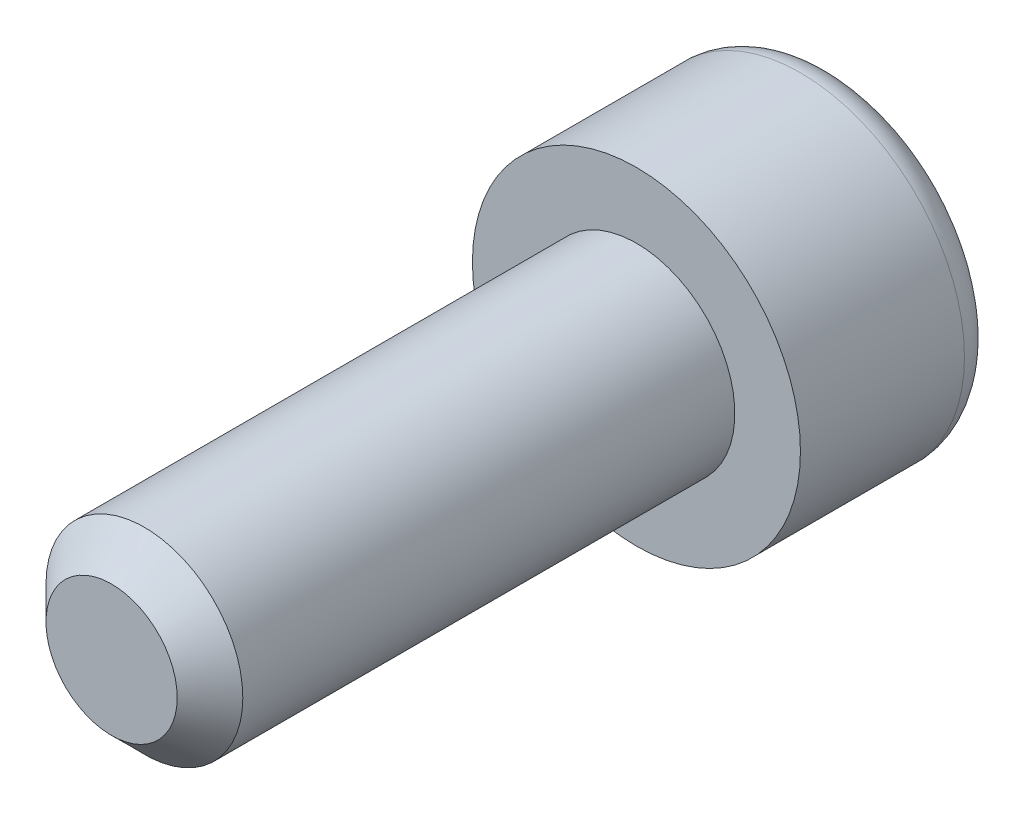
ISO-10303-21;
HEADER;
FILE_DESCRIPTION(('STEP AP214'),'2;1');
FILE_NAME('part.step','',(''),(''),'','','');
FILE_SCHEMA(('AUTOMOTIVE_DESIGN { 1 0 10303 214 1 1 1 1 }'));
ENDSEC;
DATA;
#1=APPLICATION_CONTEXT('core data for automotive mechanical design processes');
#2=APPLICATION_PROTOCOL_DEFINITION('international standard','automotive_design',2000,#1);
#3=PRODUCT_CONTEXT('',#1,'mechanical');
#4=PRODUCT('Part','Part','',(#3));
#5=PRODUCT_RELATED_PRODUCT_CATEGORY('part','',(#4));
#6=PRODUCT_DEFINITION_FORMATION('','',#4);
#7=PRODUCT_DEFINITION_CONTEXT('part definition',#1,'design');
#8=PRODUCT_DEFINITION('design','',#6,#7);
#9=PRODUCT_DEFINITION_SHAPE('','',#8);
#10=(LENGTH_UNIT() NAMED_UNIT(*) SI_UNIT(.MILLI.,.METRE.));
#11=(NAMED_UNIT(*) PLANE_ANGLE_UNIT() SI_UNIT($,.RADIAN.));
#12=(NAMED_UNIT(*) SI_UNIT($,.STERADIAN.) SOLID_ANGLE_UNIT());
#13=UNCERTAINTY_MEASURE_WITH_UNIT(LENGTH_MEASURE(1.E-05),#10,'distance_accuracy_value','');
#14=(GEOMETRIC_REPRESENTATION_CONTEXT(3) GLOBAL_UNCERTAINTY_ASSIGNED_CONTEXT((#13)) GLOBAL_UNIT_ASSIGNED_CONTEXT((#10,
#11,#12)) REPRESENTATION_CONTEXT('',''));
#15=CARTESIAN_POINT('',(0.,0.,0.));
#16=DIRECTION('',(0.,0.,1.));
#17=DIRECTION('',(1.,0.,0.));
#18=AXIS2_PLACEMENT_3D('',#15,#16,#17);
#19=CARTESIAN_POINT('',(0.,0.,8.));
#20=DIRECTION('',(0.,0.,-1.));
#21=DIRECTION('',(-1.,0.,0.));
#22=AXIS2_PLACEMENT_3D('',#19,#20,#21);
#23=CYLINDRICAL_SURFACE('',#22,1.5);
#24=CARTESIAN_POINT('',(0.,0.,7.5));
#25=DIRECTION('',(0.,0.,1.));
#26=DIRECTION('',(1.,0.,0.));
#27=AXIS2_PLACEMENT_3D('',#24,#25,#26);
#28=CIRCLE('',#27,1.5);
#29=CARTESIAN_POINT('',(1.5,0.,7.5));
#30=VERTEX_POINT('',#29);
#31=EDGE_CURVE('E151',#30,#30,#28,.F.);
#32=ORIENTED_EDGE('',*,*,#31,.T.);
#33=EDGE_LOOP('',(#32));
#34=FACE_BOUND('',#33,.T.);
#35=CARTESIAN_POINT('',(0.,0.,0.));
#36=DIRECTION('',(0.,0.,-1.));
#37=DIRECTION('',(-1.,0.,0.));
#38=AXIS2_PLACEMENT_3D('',#35,#36,#37);
#39=CIRCLE('',#38,1.5);
#40=CARTESIAN_POINT('',(-1.5,0.,0.));
#41=VERTEX_POINT('',#40);
#42=EDGE_CURVE('E145',#41,#41,#39,.T.);
#43=ORIENTED_EDGE('',*,*,#42,.F.);
#44=EDGE_LOOP('',(#43));
#45=FACE_BOUND('',#44,.T.);
#46=ADVANCED_FACE('F34',(#34,#45),#23,.T.);
#47=CARTESIAN_POINT('',(0.,0.,8.));
#48=DIRECTION('',(0.,0.,1.));
#49=DIRECTION('',(1.,0.,0.));
#50=AXIS2_PLACEMENT_3D('',#47,#48,#49);
#51=PLANE('',#50);
#52=CARTESIAN_POINT('',(0.,0.,8.));
#53=DIRECTION('',(0.,0.,1.));
#54=DIRECTION('',(1.,0.,0.));
#55=AXIS2_PLACEMENT_3D('',#52,#53,#54);
#56=CIRCLE('',#55,0.999999999999999);
#57=CARTESIAN_POINT('',(0.999999999999999,0.,8.));
#58=VERTEX_POINT('',#57);
#59=EDGE_CURVE('E148',#58,#58,#56,.T.);
#60=ORIENTED_EDGE('',*,*,#59,.T.);
#61=EDGE_LOOP('',(#60));
#62=FACE_BOUND('',#61,.T.);
#63=ADVANCED_FACE('F172',(#62),#51,.T.);
#64=CARTESIAN_POINT('',(0.,0.,8.));
#65=DIRECTION('',(0.,0.,-1.));
#66=DIRECTION('',(-1.,0.,0.));
#67=AXIS2_PLACEMENT_3D('',#64,#65,#66);
#68=CONICAL_SURFACE('',#67,0.999999999999999,0.785398163397447);
#69=ORIENTED_EDGE('',*,*,#31,.F.);
#70=EDGE_LOOP('',(#69));
#71=FACE_BOUND('',#70,.T.);
#72=ORIENTED_EDGE('',*,*,#59,.F.);
#73=EDGE_LOOP('',(#72));
#74=FACE_BOUND('',#73,.T.);
#75=ADVANCED_FACE('F177',(#71,#74),#68,.T.);
#76=CARTESIAN_POINT('',(0.,0.,0.));
#77=DIRECTION('',(0.,0.,-1.));
#78=DIRECTION('',(-1.,0.,0.));
#79=AXIS2_PLACEMENT_3D('',#76,#77,#78);
#80=PLANE('',#79);
#81=CARTESIAN_POINT('',(0.,0.,0.));
#82=DIRECTION('',(0.,0.,-1.));
#83=DIRECTION('',(-1.,0.,0.));
#84=AXIS2_PLACEMENT_3D('',#81,#82,#83);
#85=CIRCLE('',#84,2.5);
#86=CARTESIAN_POINT('',(-2.5,0.,0.));
#87=VERTEX_POINT('',#86);
#88=EDGE_CURVE('E136',#87,#87,#85,.T.);
#89=ORIENTED_EDGE('',*,*,#88,.F.);
#90=EDGE_LOOP('',(#89));
#91=FACE_BOUND('',#90,.T.);
#92=ORIENTED_EDGE('',*,*,#42,.T.);
#93=EDGE_LOOP('',(#92));
#94=FACE_BOUND('',#93,.T.);
#95=ADVANCED_FACE('F183',(#91,#94),#80,.F.);
#96=CARTESIAN_POINT('',(0.,0.,-3.));
#97=DIRECTION('',(0.,0.,1.));
#98=DIRECTION('',(1.,0.,0.));
#99=AXIS2_PLACEMENT_3D('',#96,#97,#98);
#100=CYLINDRICAL_SURFACE('',#99,2.5);
#101=CARTESIAN_POINT('',(0.,0.,-2.5));
#102=DIRECTION('',(0.,0.,-1.));
#103=DIRECTION('',(-1.,0.,0.));
#104=AXIS2_PLACEMENT_3D('',#101,#102,#103);
#105=CIRCLE('',#104,2.5);
#106=CARTESIAN_POINT('',(-2.5,0.,-2.5));
#107=VERTEX_POINT('',#106);
#108=EDGE_CURVE('E11',#107,#107,#105,.F.);
#109=ORIENTED_EDGE('',*,*,#108,.T.);
#110=EDGE_LOOP('',(#109));
#111=FACE_BOUND('',#110,.T.);
#112=ORIENTED_EDGE('',*,*,#88,.T.);
#113=EDGE_LOOP('',(#112));
#114=FACE_BOUND('',#113,.T.);
#115=ADVANCED_FACE('F167',(#111,#114),#100,.T.);
#116=CARTESIAN_POINT('',(0.,0.,-3.));
#117=DIRECTION('',(0.,0.,-1.));
#118=DIRECTION('',(-1.,0.,0.));
#119=AXIS2_PLACEMENT_3D('',#116,#117,#118);
#120=PLANE('',#119);
#121=DIRECTION('',(-0.5,0.866025403784439,0.));
#122=VECTOR('',#121,1.);
#123=CARTESIAN_POINT('',(-0.866025403784439,-1.5,-3.));
#124=LINE('',#123,#122);
#125=CARTESIAN_POINT('',(-0.866025403784439,-1.5,-3.));
#126=VERTEX_POINT('',#125);
#127=CARTESIAN_POINT('',(-1.73205080756888,0.,-3.));
#128=VERTEX_POINT('',#127);
#129=EDGE_CURVE('E48',#126,#128,#124,.T.);
#130=ORIENTED_EDGE('',*,*,#129,.F.);
#131=DIRECTION('',(-1.,0.,0.));
#132=VECTOR('',#131,1.);
#133=CARTESIAN_POINT('',(0.866025403784439,-1.5,-3.));
#134=LINE('',#133,#132);
#135=CARTESIAN_POINT('',(0.866025403784439,-1.5,-3.));
#136=VERTEX_POINT('',#135);
#137=EDGE_CURVE('E118',#136,#126,#134,.T.);
#138=ORIENTED_EDGE('',*,*,#137,.F.);
#139=DIRECTION('',(-0.5,-0.866025403784439,0.));
#140=VECTOR('',#139,1.);
#141=CARTESIAN_POINT('',(1.73205080756888,0.,-3.));
#142=LINE('',#141,#140);
#143=CARTESIAN_POINT('',(1.73205080756888,0.,-3.));
#144=VERTEX_POINT('',#143);
#145=EDGE_CURVE('E112',#144,#136,#142,.T.);
#146=ORIENTED_EDGE('',*,*,#145,.F.);
#147=DIRECTION('',(0.5,-0.866025403784439,0.));
#148=VECTOR('',#147,1.);
#149=CARTESIAN_POINT('',(0.866025403784439,1.5,-3.));
#150=LINE('',#149,#148);
#151=CARTESIAN_POINT('',(0.866025403784439,1.5,-3.));
#152=VERTEX_POINT('',#151);
#153=EDGE_CURVE('E110',#152,#144,#150,.T.);
#154=ORIENTED_EDGE('',*,*,#153,.F.);
#155=DIRECTION('',(1.,0.,0.));
#156=VECTOR('',#155,1.);
#157=CARTESIAN_POINT('',(-0.866025403784438,1.5,-3.));
#158=LINE('',#157,#156);
#159=CARTESIAN_POINT('',(-0.866025403784438,1.5,-3.));
#160=VERTEX_POINT('',#159);
#161=EDGE_CURVE('E91',#160,#152,#158,.T.);
#162=ORIENTED_EDGE('',*,*,#161,.F.);
#163=DIRECTION('',(0.5,0.866025403784438,0.));
#164=VECTOR('',#163,1.);
#165=CARTESIAN_POINT('',(-1.73205080756888,0.,-3.));
#166=LINE('',#165,#164);
#167=EDGE_CURVE('E102',#128,#160,#166,.T.);
#168=ORIENTED_EDGE('',*,*,#167,.F.);
#169=EDGE_LOOP('',(#130,#138,#146,#154,#162,#168));
#170=FACE_BOUND('',#169,.T.);
#171=CARTESIAN_POINT('',(0.,0.,-3.));
#172=DIRECTION('',(0.,0.,-1.));
#173=DIRECTION('',(-1.,0.,0.));
#174=AXIS2_PLACEMENT_3D('',#171,#172,#173);
#175=CIRCLE('',#174,2.);
#176=CARTESIAN_POINT('',(-2.,0.,-3.));
#177=VERTEX_POINT('',#176);
#178=EDGE_CURVE('E41',#177,#177,#175,.T.);
#179=ORIENTED_EDGE('',*,*,#178,.T.);
#180=EDGE_LOOP('',(#179));
#181=FACE_BOUND('',#180,.T.);
#182=ADVANCED_FACE('F106',(#170,#181),#120,.T.);
#183=CARTESIAN_POINT('',(0.,0.,-2.5));
#184=DIRECTION('',(0.,0.,-1.));
#185=DIRECTION('',(-1.,0.,0.));
#186=AXIS2_PLACEMENT_3D('',#183,#184,#185);
#187=TOROIDAL_SURFACE('',#186,2.,0.5);
#188=ORIENTED_EDGE('',*,*,#108,.F.);
#189=EDGE_LOOP('',(#188));
#190=FACE_BOUND('',#189,.T.);
#191=ORIENTED_EDGE('',*,*,#178,.F.);
#192=EDGE_LOOP('',(#191));
#193=FACE_BOUND('',#192,.T.);
#194=ADVANCED_FACE('F156',(#190,#193),#187,.T.);
#195=CARTESIAN_POINT('',(-0.866025403784439,-1.5,-0.5));
#196=DIRECTION('',(-0.866025403784439,-0.5,0.));
#197=DIRECTION('',(0.5,-0.866025403784439,0.));
#198=AXIS2_PLACEMENT_3D('',#195,#196,#197);
#199=PLANE('',#198);
#200=ORIENTED_EDGE('',*,*,#129,.T.);
#201=DIRECTION('',(0.,0.,-1.));
#202=VECTOR('',#201,1.);
#203=CARTESIAN_POINT('',(-1.73205080756888,0.,-0.5));
#204=LINE('',#203,#202);
#205=CARTESIAN_POINT('',(-1.73205080756888,0.,-0.5));
#206=VERTEX_POINT('',#205);
#207=EDGE_CURVE('E99',#206,#128,#204,.T.);
#208=ORIENTED_EDGE('',*,*,#207,.F.);
#209=DIRECTION('',(-0.5,0.866025403784439,0.));
#210=VECTOR('',#209,1.);
#211=CARTESIAN_POINT('',(-0.866025403784439,-1.5,-0.5));
#212=LINE('',#211,#210);
#213=CARTESIAN_POINT('',(-0.866025403784439,-1.5,-0.5));
#214=VERTEX_POINT('',#213);
#215=EDGE_CURVE('E120',#214,#206,#212,.T.);
#216=ORIENTED_EDGE('',*,*,#215,.F.);
#217=DIRECTION('',(0.,0.,-1.));
#218=VECTOR('',#217,1.);
#219=CARTESIAN_POINT('',(-0.866025403784439,-1.5,-0.5));
#220=LINE('',#219,#218);
#221=EDGE_CURVE('E55',#214,#126,#220,.T.);
#222=ORIENTED_EDGE('',*,*,#221,.T.);
#223=EDGE_LOOP('',(#200,#208,#216,#222));
#224=FACE_BOUND('',#223,.T.);
#225=ADVANCED_FACE('F158',(#224),#199,.F.);
#226=CARTESIAN_POINT('',(0.866025403784439,-1.5,-0.5));
#227=DIRECTION('',(0.,-1.,0.));
#228=DIRECTION('',(0.,0.,-1.));
#229=AXIS2_PLACEMENT_3D('',#226,#227,#228);
#230=PLANE('',#229);
#231=ORIENTED_EDGE('',*,*,#137,.T.);
#232=ORIENTED_EDGE('',*,*,#221,.F.);
#233=DIRECTION('',(-1.,0.,0.));
#234=VECTOR('',#233,1.);
#235=CARTESIAN_POINT('',(0.866025403784439,-1.5,-0.5));
#236=LINE('',#235,#234);
#237=CARTESIAN_POINT('',(0.866025403784439,-1.5,-0.5));
#238=VERTEX_POINT('',#237);
#239=EDGE_CURVE('E132',#238,#214,#236,.T.);
#240=ORIENTED_EDGE('',*,*,#239,.F.);
#241=DIRECTION('',(0.,0.,-1.));
#242=VECTOR('',#241,1.);
#243=CARTESIAN_POINT('',(0.866025403784439,-1.5,-0.5));
#244=LINE('',#243,#242);
#245=EDGE_CURVE('E137',#238,#136,#244,.T.);
#246=ORIENTED_EDGE('',*,*,#245,.T.);
#247=EDGE_LOOP('',(#231,#232,#240,#246));
#248=FACE_BOUND('',#247,.T.);
#249=ADVANCED_FACE('F165',(#248),#230,.F.);
#250=CARTESIAN_POINT('',(1.73205080756888,0.,-0.5));
#251=DIRECTION('',(0.866025403784439,-0.5,0.));
#252=DIRECTION('',(0.5,0.866025403784439,0.));
#253=AXIS2_PLACEMENT_3D('',#250,#251,#252);
#254=PLANE('',#253);
#255=ORIENTED_EDGE('',*,*,#145,.T.);
#256=ORIENTED_EDGE('',*,*,#245,.F.);
#257=DIRECTION('',(-0.5,-0.866025403784439,0.));
#258=VECTOR('',#257,1.);
#259=CARTESIAN_POINT('',(1.73205080756888,0.,-0.5));
#260=LINE('',#259,#258);
#261=CARTESIAN_POINT('',(1.73205080756888,0.,-0.5));
#262=VERTEX_POINT('',#261);
#263=EDGE_CURVE('E129',#262,#238,#260,.T.);
#264=ORIENTED_EDGE('',*,*,#263,.F.);
#265=DIRECTION('',(0.,0.,-1.));
#266=VECTOR('',#265,1.);
#267=CARTESIAN_POINT('',(1.73205080756888,0.,-0.5));
#268=LINE('',#267,#266);
#269=EDGE_CURVE('E139',#262,#144,#268,.T.);
#270=ORIENTED_EDGE('',*,*,#269,.T.);
#271=EDGE_LOOP('',(#255,#256,#264,#270));
#272=FACE_BOUND('',#271,.T.);
#273=ADVANCED_FACE('F243',(#272),#254,.F.);
#274=CARTESIAN_POINT('',(0.866025403784439,1.5,-0.5));
#275=DIRECTION('',(0.866025403784439,0.5,0.));
#276=DIRECTION('',(-0.5,0.866025403784439,0.));
#277=AXIS2_PLACEMENT_3D('',#274,#275,#276);
#278=PLANE('',#277);
#279=ORIENTED_EDGE('',*,*,#153,.T.);
#280=ORIENTED_EDGE('',*,*,#269,.F.);
#281=DIRECTION('',(0.5,-0.866025403784439,0.));
#282=VECTOR('',#281,1.);
#283=CARTESIAN_POINT('',(0.866025403784439,1.5,-0.5));
#284=LINE('',#283,#282);
#285=CARTESIAN_POINT('',(0.866025403784439,1.5,-0.5));
#286=VERTEX_POINT('',#285);
#287=EDGE_CURVE('E126',#286,#262,#284,.T.);
#288=ORIENTED_EDGE('',*,*,#287,.F.);
#289=DIRECTION('',(0.,0.,-1.));
#290=VECTOR('',#289,1.);
#291=CARTESIAN_POINT('',(0.866025403784439,1.5,-0.5));
#292=LINE('',#291,#290);
#293=EDGE_CURVE('E98',#286,#152,#292,.T.);
#294=ORIENTED_EDGE('',*,*,#293,.T.);
#295=EDGE_LOOP('',(#279,#280,#288,#294));
#296=FACE_BOUND('',#295,.T.);
#297=ADVANCED_FACE('F251',(#296),#278,.F.);
#298=CARTESIAN_POINT('',(-0.866025403784438,1.5,-0.5));
#299=DIRECTION('',(0.,1.,0.));
#300=DIRECTION('',(-1.,0.,0.));
#301=AXIS2_PLACEMENT_3D('',#298,#299,#300);
#302=PLANE('',#301);
#303=ORIENTED_EDGE('',*,*,#161,.T.);
#304=ORIENTED_EDGE('',*,*,#293,.F.);
#305=DIRECTION('',(1.,0.,0.));
#306=VECTOR('',#305,1.);
#307=CARTESIAN_POINT('',(-0.866025403784438,1.5,-0.5));
#308=LINE('',#307,#306);
#309=CARTESIAN_POINT('',(-0.866025403784438,1.5,-0.5));
#310=VERTEX_POINT('',#309);
#311=EDGE_CURVE('E94',#310,#286,#308,.T.);
#312=ORIENTED_EDGE('',*,*,#311,.F.);
#313=DIRECTION('',(0.,0.,-1.));
#314=VECTOR('',#313,1.);
#315=CARTESIAN_POINT('',(-0.866025403784438,1.5,-0.5));
#316=LINE('',#315,#314);
#317=EDGE_CURVE('E87',#310,#160,#316,.T.);
#318=ORIENTED_EDGE('',*,*,#317,.T.);
#319=EDGE_LOOP('',(#303,#304,#312,#318));
#320=FACE_BOUND('',#319,.T.);
#321=ADVANCED_FACE('F89',(#320),#302,.F.);
#322=CARTESIAN_POINT('',(-1.73205080756888,0.,-0.5));
#323=DIRECTION('',(-0.866025403784439,0.5,0.));
#324=DIRECTION('',(-0.5,-0.866025403784439,0.));
#325=AXIS2_PLACEMENT_3D('',#322,#323,#324);
#326=PLANE('',#325);
#327=ORIENTED_EDGE('',*,*,#167,.T.);
#328=ORIENTED_EDGE('',*,*,#317,.F.);
#329=DIRECTION('',(0.5,0.866025403784438,0.));
#330=VECTOR('',#329,1.);
#331=CARTESIAN_POINT('',(-1.73205080756888,0.,-0.5));
#332=LINE('',#331,#330);
#333=EDGE_CURVE('E123',#206,#310,#332,.T.);
#334=ORIENTED_EDGE('',*,*,#333,.F.);
#335=ORIENTED_EDGE('',*,*,#207,.T.);
#336=EDGE_LOOP('',(#327,#328,#334,#335));
#337=FACE_BOUND('',#336,.T.);
#338=ADVANCED_FACE('F103',(#337),#326,.F.);
#339=CARTESIAN_POINT('',(-0.866025403784439,-1.5,-0.5));
#340=DIRECTION('',(0.,0.,1.));
#341=DIRECTION('',(1.,0.,0.));
#342=AXIS2_PLACEMENT_3D('',#339,#340,#341);
#343=PLANE('',#342);
#344=ORIENTED_EDGE('',*,*,#215,.T.);
#345=ORIENTED_EDGE('',*,*,#333,.T.);
#346=ORIENTED_EDGE('',*,*,#311,.T.);
#347=ORIENTED_EDGE('',*,*,#287,.T.);
#348=ORIENTED_EDGE('',*,*,#263,.T.);
#349=ORIENTED_EDGE('',*,*,#239,.T.);
#350=EDGE_LOOP('',(#344,#345,#346,#347,#348,#349));
#351=FACE_BOUND('',#350,.T.);
#352=ADVANCED_FACE('F275',(#351),#343,.F.);
#353=CLOSED_SHELL('',(#46,#63,#75,#95,#115,#182,#194,#225,#249,#273,#297,#321,#338,#352));
#354=MANIFOLD_SOLID_BREP('B2',#353);
#355=ADVANCED_BREP_SHAPE_REPRESENTATION('',(#18,#354),#14);
#356=SHAPE_DEFINITION_REPRESENTATION(#9,#355);
ENDSEC;
END-ISO-10303-21;
